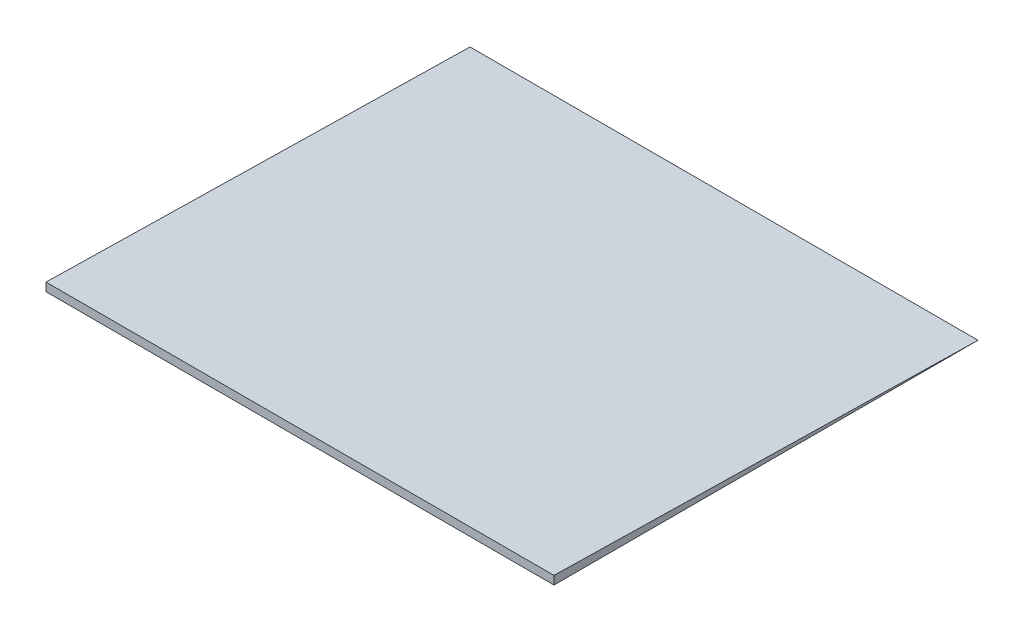
ISO-10303-21;
HEADER;
FILE_DESCRIPTION(('STEP AP214'),'2;1');
FILE_NAME('part.step','',(''),(''),'','','');
FILE_SCHEMA(('AUTOMOTIVE_DESIGN { 1 0 10303 214 1 1 1 1 }'));
ENDSEC;
DATA;
#1=APPLICATION_CONTEXT('core data for automotive mechanical design processes');
#2=APPLICATION_PROTOCOL_DEFINITION('international standard','automotive_design',2000,#1);
#3=PRODUCT_CONTEXT('',#1,'mechanical');
#4=PRODUCT('Part','Part','',(#3));
#5=PRODUCT_RELATED_PRODUCT_CATEGORY('part','',(#4));
#6=PRODUCT_DEFINITION_FORMATION('','',#4);
#7=PRODUCT_DEFINITION_CONTEXT('part definition',#1,'design');
#8=PRODUCT_DEFINITION('design','',#6,#7);
#9=PRODUCT_DEFINITION_SHAPE('','',#8);
#10=(LENGTH_UNIT() NAMED_UNIT(*) SI_UNIT(.MILLI.,.METRE.));
#11=(NAMED_UNIT(*) PLANE_ANGLE_UNIT() SI_UNIT($,.RADIAN.));
#12=(NAMED_UNIT(*) SI_UNIT($,.STERADIAN.) SOLID_ANGLE_UNIT());
#13=UNCERTAINTY_MEASURE_WITH_UNIT(LENGTH_MEASURE(1.E-05),#10,'distance_accuracy_value','');
#14=(GEOMETRIC_REPRESENTATION_CONTEXT(3) GLOBAL_UNCERTAINTY_ASSIGNED_CONTEXT((#13)) GLOBAL_UNIT_ASSIGNED_CONTEXT((#10,
#11,#12)) REPRESENTATION_CONTEXT('',''));
#15=CARTESIAN_POINT('',(0.,0.,0.));
#16=DIRECTION('',(0.,0.,1.));
#17=DIRECTION('',(1.,0.,0.));
#18=AXIS2_PLACEMENT_3D('',#15,#16,#17);
#19=CARTESIAN_POINT('',(-91.,3.,-75.955));
#20=DIRECTION('',(1.,0.,0.));
#21=DIRECTION('',(0.,0.,-1.));
#22=AXIS2_PLACEMENT_3D('',#19,#20,#21);
#23=PLANE('',#22);
#24=DIRECTION('',(0.,-1.,0.));
#25=VECTOR('',#24,1.);
#26=CARTESIAN_POINT('',(-91.,3.,75.955));
#27=LINE('',#26,#25);
#28=CARTESIAN_POINT('',(-91.,3.,75.9550000000003));
#29=VERTEX_POINT('',#28);
#30=CARTESIAN_POINT('',(-91.,0.,75.955));
#31=VERTEX_POINT('',#30);
#32=EDGE_CURVE('E11',#29,#31,#27,.T.);
#33=ORIENTED_EDGE('',*,*,#32,.F.);
#34=DIRECTION('',(0.,-0.0197446854327578,-0.999805054696745));
#35=VECTOR('',#34,1.);
#36=CARTESIAN_POINT('',(-91.0000000000001,0.,-75.9549999999997));
#37=LINE('',#36,#35);
#38=CARTESIAN_POINT('',(-91.0000000000001,0.,-75.9549999999997));
#39=VERTEX_POINT('',#38);
#40=EDGE_CURVE('E75',#29,#39,#37,.T.);
#41=ORIENTED_EDGE('',*,*,#40,.T.);
#42=DIRECTION('',(0.,0.,1.));
#43=VECTOR('',#42,1.);
#44=CARTESIAN_POINT('',(-91.,0.,-75.955));
#45=LINE('',#44,#43);
#46=EDGE_CURVE('E87',#39,#31,#45,.T.);
#47=ORIENTED_EDGE('',*,*,#46,.T.);
#48=EDGE_LOOP('',(#33,#41,#47));
#49=FACE_BOUND('',#48,.T.);
#50=ADVANCED_FACE('F39',(#49),#23,.F.);
#51=CARTESIAN_POINT('',(91.0000000000001,3.,75.955));
#52=DIRECTION('',(0.,0.,-1.));
#53=DIRECTION('',(-1.,0.,0.));
#54=AXIS2_PLACEMENT_3D('',#51,#52,#53);
#55=PLANE('',#54);
#56=DIRECTION('',(1.,0.,0.));
#57=VECTOR('',#56,1.);
#58=CARTESIAN_POINT('',(91.0000000000001,0.,75.955));
#59=LINE('',#58,#57);
#60=CARTESIAN_POINT('',(91.0000000000001,0.,75.955));
#61=VERTEX_POINT('',#60);
#62=EDGE_CURVE('E61',#31,#61,#59,.T.);
#63=ORIENTED_EDGE('',*,*,#62,.T.);
#64=DIRECTION('',(0.,-1.,0.));
#65=VECTOR('',#64,1.);
#66=CARTESIAN_POINT('',(91.0000000000001,3.,75.955));
#67=LINE('',#66,#65);
#68=CARTESIAN_POINT('',(91.0000000000001,3.,75.9550000000003));
#69=VERTEX_POINT('',#68);
#70=EDGE_CURVE('E47',#69,#61,#67,.T.);
#71=ORIENTED_EDGE('',*,*,#70,.F.);
#72=DIRECTION('',(1.,0.,0.));
#73=VECTOR('',#72,1.);
#74=CARTESIAN_POINT('',(91.0000000000001,3.,75.955));
#75=LINE('',#74,#73);
#76=EDGE_CURVE('E81',#29,#69,#75,.T.);
#77=ORIENTED_EDGE('',*,*,#76,.F.);
#78=ORIENTED_EDGE('',*,*,#32,.T.);
#79=EDGE_LOOP('',(#63,#71,#77,#78));
#80=FACE_BOUND('',#79,.T.);
#81=ADVANCED_FACE('F104',(#80),#55,.F.);
#82=CARTESIAN_POINT('',(91.,3.,-75.955));
#83=DIRECTION('',(-1.,0.,0.));
#84=DIRECTION('',(0.,0.,1.));
#85=AXIS2_PLACEMENT_3D('',#82,#83,#84);
#86=PLANE('',#85);
#87=DIRECTION('',(0.,0.,-1.));
#88=VECTOR('',#87,1.);
#89=CARTESIAN_POINT('',(91.,0.,-75.955));
#90=LINE('',#89,#88);
#91=CARTESIAN_POINT('',(91.,0.,-75.955));
#92=VERTEX_POINT('',#91);
#93=EDGE_CURVE('E82',#61,#92,#90,.T.);
#94=ORIENTED_EDGE('',*,*,#93,.T.);
#95=DIRECTION('',(0.,-0.0197446854327578,-0.999805054696745));
#96=VECTOR('',#95,1.);
#97=CARTESIAN_POINT('',(91.,0.,-75.9549999999997));
#98=LINE('',#97,#96);
#99=EDGE_CURVE('E54',#69,#92,#98,.T.);
#100=ORIENTED_EDGE('',*,*,#99,.F.);
#101=ORIENTED_EDGE('',*,*,#70,.T.);
#102=EDGE_LOOP('',(#94,#100,#101));
#103=FACE_BOUND('',#102,.T.);
#104=ADVANCED_FACE('F102',(#103),#86,.F.);
#105=CARTESIAN_POINT('',(0.,0.,0.));
#106=DIRECTION('',(0.,-1.,0.));
#107=DIRECTION('',(0.,0.,-1.));
#108=AXIS2_PLACEMENT_3D('',#105,#106,#107);
#109=PLANE('',#108);
#110=ORIENTED_EDGE('',*,*,#46,.F.);
#111=DIRECTION('',(-1.,0.,0.));
#112=VECTOR('',#111,1.);
#113=CARTESIAN_POINT('',(91.,0.,-75.955));
#114=LINE('',#113,#112);
#115=EDGE_CURVE('E72',#92,#39,#114,.T.);
#116=ORIENTED_EDGE('',*,*,#115,.F.);
#117=ORIENTED_EDGE('',*,*,#93,.F.);
#118=ORIENTED_EDGE('',*,*,#62,.F.);
#119=EDGE_LOOP('',(#110,#116,#117,#118));
#120=FACE_BOUND('',#119,.T.);
#121=ADVANCED_FACE('F90',(#120),#109,.T.);
#122=CARTESIAN_POINT('',(-91.0000000000001,0.,-75.9549999999997));
#123=DIRECTION('',(0.,-0.999805054696745,0.0197446854327578));
#124=DIRECTION('',(0.,-0.0197446854327578,-0.999805054696745));
#125=AXIS2_PLACEMENT_3D('',#122,#123,#124);
#126=PLANE('',#125);
#127=ORIENTED_EDGE('',*,*,#99,.T.);
#128=ORIENTED_EDGE('',*,*,#115,.T.);
#129=ORIENTED_EDGE('',*,*,#40,.F.);
#130=ORIENTED_EDGE('',*,*,#76,.T.);
#131=EDGE_LOOP('',(#127,#128,#129,#130));
#132=FACE_BOUND('',#131,.T.);
#133=ADVANCED_FACE('F74',(#132),#126,.F.);
#134=CLOSED_SHELL('',(#50,#81,#104,#121,#133));
#135=MANIFOLD_SOLID_BREP('B2',#134);
#136=ADVANCED_BREP_SHAPE_REPRESENTATION('',(#18,#135),#14);
#137=SHAPE_DEFINITION_REPRESENTATION(#9,#136);
ENDSEC;
END-ISO-10303-21;
